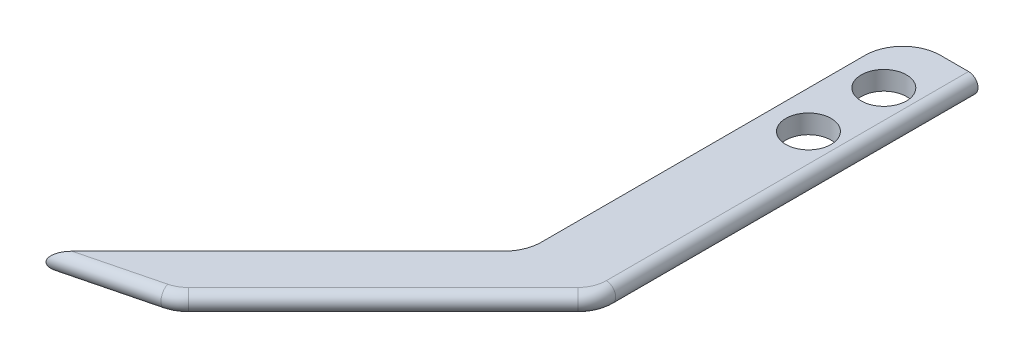
ISO-10303-21;
HEADER;
FILE_DESCRIPTION(('STEP AP214'),'2;1');
FILE_NAME('part.step','',(''),(''),'','','');
FILE_SCHEMA(('AUTOMOTIVE_DESIGN { 1 0 10303 214 1 1 1 1 }'));
ENDSEC;
DATA;
#1=APPLICATION_CONTEXT('core data for automotive mechanical design processes');
#2=APPLICATION_PROTOCOL_DEFINITION('international standard','automotive_design',2000,#1);
#3=PRODUCT_CONTEXT('',#1,'mechanical');
#4=PRODUCT('Part','Part','',(#3));
#5=PRODUCT_RELATED_PRODUCT_CATEGORY('part','',(#4));
#6=PRODUCT_DEFINITION_FORMATION('','',#4);
#7=PRODUCT_DEFINITION_CONTEXT('part definition',#1,'design');
#8=PRODUCT_DEFINITION('design','',#6,#7);
#9=PRODUCT_DEFINITION_SHAPE('','',#8);
#10=(LENGTH_UNIT() NAMED_UNIT(*) SI_UNIT(.MILLI.,.METRE.));
#11=(NAMED_UNIT(*) PLANE_ANGLE_UNIT() SI_UNIT($,.RADIAN.));
#12=(NAMED_UNIT(*) SI_UNIT($,.STERADIAN.) SOLID_ANGLE_UNIT());
#13=UNCERTAINTY_MEASURE_WITH_UNIT(LENGTH_MEASURE(1.E-05),#10,'distance_accuracy_value','');
#14=(GEOMETRIC_REPRESENTATION_CONTEXT(3) GLOBAL_UNCERTAINTY_ASSIGNED_CONTEXT((#13)) GLOBAL_UNIT_ASSIGNED_CONTEXT((#10,
#11,#12)) REPRESENTATION_CONTEXT('',''));
#15=CARTESIAN_POINT('',(0.,0.,0.));
#16=DIRECTION('',(0.,0.,1.));
#17=DIRECTION('',(1.,0.,0.));
#18=AXIS2_PLACEMENT_3D('',#15,#16,#17);
#19=CARTESIAN_POINT('',(9.95446971383413,2.5,96.1124874977272));
#20=DIRECTION('',(0.,1.,0.));
#21=DIRECTION('',(0.,0.,1.));
#22=AXIS2_PLACEMENT_3D('',#19,#20,#21);
#23=TOROIDAL_SURFACE('',#22,7.5,2.5);
#24=CARTESIAN_POINT('',(17.4544697138341,2.5,96.1124874977272));
#25=DIRECTION('',(0.,0.,-1.));
#26=DIRECTION('',(-1.,0.,0.));
#27=AXIS2_PLACEMENT_3D('',#24,#25,#26);
#28=CIRCLE('',#27,2.5);
#29=CARTESIAN_POINT('',(17.4544697138341,5.,96.1124874977272));
#30=VERTEX_POINT('',#29);
#31=CARTESIAN_POINT('',(17.4544697138341,0.,96.1124874977272));
#32=VERTEX_POINT('',#31);
#33=EDGE_CURVE('E11',#30,#32,#28,.T.);
#34=ORIENTED_EDGE('',*,*,#33,.F.);
#35=CARTESIAN_POINT('',(9.95446971383413,5.,96.1124874977272));
#36=DIRECTION('',(0.,1.,0.));
#37=DIRECTION('',(0.,0.,1.));
#38=AXIS2_PLACEMENT_3D('',#35,#36,#37);
#39=CIRCLE('',#38,7.5);
#40=CARTESIAN_POINT('',(15.2577705727332,5.,101.415788356626));
#41=VERTEX_POINT('',#40);
#42=EDGE_CURVE('E165',#41,#30,#39,.T.);
#43=ORIENTED_EDGE('',*,*,#42,.F.);
#44=CARTESIAN_POINT('',(15.2577705727332,2.5,101.415788356626));
#45=DIRECTION('',(0.70710678118654,0.,-0.707106781186555));
#46=DIRECTION('',(-0.707106781186555,0.,-0.70710678118654));
#47=AXIS2_PLACEMENT_3D('',#44,#45,#46);
#48=CIRCLE('',#47,2.5);
#49=CARTESIAN_POINT('',(15.2577705727332,0.,101.415788356626));
#50=VERTEX_POINT('',#49);
#51=EDGE_CURVE('E48',#41,#50,#48,.T.);
#52=ORIENTED_EDGE('',*,*,#51,.T.);
#53=CARTESIAN_POINT('',(9.95446971383413,0.,96.1124874977272));
#54=DIRECTION('',(0.,1.,0.));
#55=DIRECTION('',(0.,0.,1.));
#56=AXIS2_PLACEMENT_3D('',#53,#54,#55);
#57=CIRCLE('',#56,7.5);
#58=EDGE_CURVE('E180',#32,#50,#57,.F.);
#59=ORIENTED_EDGE('',*,*,#58,.F.);
#60=EDGE_LOOP('',(#34,#43,#52,#59));
#61=FACE_BOUND('',#60,.T.);
#62=ADVANCED_FACE('F39',(#61),#23,.T.);
#63=CARTESIAN_POINT('',(-36.431223227239,2.5,153.104782156599));
#64=DIRECTION('',(0.707106781186547,0.,-0.707106781186548));
#65=DIRECTION('',(-0.707106781186548,0.,-0.707106781186547));
#66=AXIS2_PLACEMENT_3D('',#63,#64,#65);
#67=CYLINDRICAL_SURFACE('',#66,2.5);
#68=ORIENTED_EDGE('',*,*,#51,.F.);
#69=DIRECTION('',(-0.707106781186547,0.,0.707106781186548));
#70=VECTOR('',#69,1.);
#71=CARTESIAN_POINT('',(-36.431223227239,5.,153.104782156599));
#72=LINE('',#71,#70);
#73=CARTESIAN_POINT('',(-36.4312232272391,5.,153.104782156599));
#74=VERTEX_POINT('',#73);
#75=EDGE_CURVE('E168',#74,#41,#72,.F.);
#76=ORIENTED_EDGE('',*,*,#75,.F.);
#77=CARTESIAN_POINT('',(-36.431223227239,2.5,153.104782156599));
#78=DIRECTION('',(0.70710678118655,0.,-0.707106781186545));
#79=DIRECTION('',(-0.707106781186545,0.,-0.70710678118655));
#80=AXIS2_PLACEMENT_3D('',#77,#78,#79);
#81=CIRCLE('',#80,2.5);
#82=CARTESIAN_POINT('',(-36.4312232272391,0.,153.104782156599));
#83=VERTEX_POINT('',#82);
#84=EDGE_CURVE('E63',#74,#83,#81,.T.);
#85=ORIENTED_EDGE('',*,*,#84,.T.);
#86=DIRECTION('',(0.707106781186547,0.,-0.707106781186548));
#87=VECTOR('',#86,1.);
#88=CARTESIAN_POINT('',(58.3367794646798,0.,58.3367794646797));
#89=LINE('',#88,#87);
#90=EDGE_CURVE('E183',#50,#83,#89,.F.);
#91=ORIENTED_EDGE('',*,*,#90,.F.);
#92=EDGE_LOOP('',(#68,#76,#85,#91));
#93=FACE_BOUND('',#92,.T.);
#94=ADVANCED_FACE('F198',(#93),#67,.T.);
#95=CARTESIAN_POINT('',(-41.7345240861382,2.5,147.801481297699));
#96=DIRECTION('',(0.,1.,0.));
#97=DIRECTION('',(0.,0.,1.));
#98=AXIS2_PLACEMENT_3D('',#95,#96,#97);
#99=TOROIDAL_SURFACE('',#98,7.5,2.5);
#100=ORIENTED_EDGE('',*,*,#84,.F.);
#101=CARTESIAN_POINT('',(-41.7345240861382,5.,147.801481297699));
#102=DIRECTION('',(0.,1.,0.));
#103=DIRECTION('',(0.,0.,1.));
#104=AXIS2_PLACEMENT_3D('',#101,#102,#103);
#105=CIRCLE('',#104,7.5);
#106=CARTESIAN_POINT('',(-39.9003000369376,5.,155.073731440354));
#107=VERTEX_POINT('',#106);
#108=EDGE_CURVE('E171',#107,#74,#105,.T.);
#109=ORIENTED_EDGE('',*,*,#108,.F.);
#110=CARTESIAN_POINT('',(-39.9003000369377,2.5,155.073731440354));
#111=DIRECTION('',(0.969633352353896,0.,-0.244563206560073));
#112=DIRECTION('',(-0.244563206560073,0.,-0.969633352353896));
#113=AXIS2_PLACEMENT_3D('',#110,#111,#112);
#114=CIRCLE('',#113,2.5);
#115=CARTESIAN_POINT('',(-39.9003000369376,0.,155.073731440354));
#116=VERTEX_POINT('',#115);
#117=EDGE_CURVE('E55',#107,#116,#114,.T.);
#118=ORIENTED_EDGE('',*,*,#117,.T.);
#119=CARTESIAN_POINT('',(-41.7345240861382,0.,147.801481297699));
#120=DIRECTION('',(0.,1.,0.));
#121=DIRECTION('',(0.,0.,1.));
#122=AXIS2_PLACEMENT_3D('',#119,#120,#121);
#123=CIRCLE('',#122,7.5);
#124=EDGE_CURVE('E186',#83,#116,#123,.F.);
#125=ORIENTED_EDGE('',*,*,#124,.F.);
#126=EDGE_LOOP('',(#100,#109,#118,#125));
#127=FACE_BOUND('',#126,.T.);
#128=ADVANCED_FACE('F210',(#127),#99,.T.);
#129=CARTESIAN_POINT('',(-60.1916680428544,2.5,160.191668042854));
#130=DIRECTION('',(0.969633352353897,0.,-0.24456320656007));
#131=DIRECTION('',(-0.24456320656007,0.,-0.969633352353897));
#132=AXIS2_PLACEMENT_3D('',#129,#130,#131);
#133=CYLINDRICAL_SURFACE('',#132,2.5);
#134=ORIENTED_EDGE('',*,*,#117,.F.);
#135=DIRECTION('',(-0.969633352353897,0.,0.24456320656007));
#136=VECTOR('',#135,1.);
#137=CARTESIAN_POINT('',(-60.1916680428544,5.,160.191668042854));
#138=LINE('',#137,#136);
#139=CARTESIAN_POINT('',(-60.1916680428543,5.,160.191668042854));
#140=VERTEX_POINT('',#139);
#141=EDGE_CURVE('E174',#140,#107,#138,.F.);
#142=ORIENTED_EDGE('',*,*,#141,.F.);
#143=CARTESIAN_POINT('',(-60.1916680428543,2.5,160.191668042854));
#144=DIRECTION('',(0.707106781186548,0.,0.707106781186548));
#145=DIRECTION('',(0.707106781186548,0.,-0.707106781186548));
#146=AXIS2_PLACEMENT_3D('',#143,#144,#145);
#147=ELLIPSE('',#146,4.87612671193617,2.5);
#148=CARTESIAN_POINT('',(-60.1916680428543,0.,160.191668042854));
#149=VERTEX_POINT('',#148);
#150=EDGE_CURVE('E190',#149,#140,#147,.F.);
#151=ORIENTED_EDGE('',*,*,#150,.F.);
#152=DIRECTION('',(0.969633352353897,0.,-0.24456320656007));
#153=VECTOR('',#152,1.);
#154=CARTESIAN_POINT('',(34.3871806017733,0.,136.336768207636));
#155=LINE('',#154,#153);
#156=EDGE_CURVE('E188',#116,#149,#155,.F.);
#157=ORIENTED_EDGE('',*,*,#156,.F.);
#158=EDGE_LOOP('',(#134,#142,#151,#157));
#159=FACE_BOUND('',#158,.T.);
#160=ADVANCED_FACE('F266',(#159),#133,.T.);
#161=CARTESIAN_POINT('',(17.4544697138341,2.5,96.1124874977272));
#162=DIRECTION('',(0.,0.,-1.));
#163=DIRECTION('',(-1.,0.,0.));
#164=AXIS2_PLACEMENT_3D('',#161,#162,#163);
#165=CYLINDRICAL_SURFACE('',#164,2.5);
#166=DIRECTION('',(0.,0.,1.));
#167=VECTOR('',#166,1.);
#168=CARTESIAN_POINT('',(17.4544697138341,5.,96.1124874977272));
#169=LINE('',#168,#167);
#170=CARTESIAN_POINT('',(17.4544697138342,5.,0.));
#171=VERTEX_POINT('',#170);
#172=EDGE_CURVE('E162',#30,#171,#169,.F.);
#173=ORIENTED_EDGE('',*,*,#172,.F.);
#174=ORIENTED_EDGE('',*,*,#33,.T.);
#175=DIRECTION('',(0.,0.,-1.));
#176=VECTOR('',#175,1.);
#177=CARTESIAN_POINT('',(17.4544697138342,0.,0.));
#178=LINE('',#177,#176);
#179=CARTESIAN_POINT('',(17.4544697138342,0.,0.));
#180=VERTEX_POINT('',#179);
#181=EDGE_CURVE('E177',#180,#32,#178,.F.);
#182=ORIENTED_EDGE('',*,*,#181,.F.);
#183=CARTESIAN_POINT('',(17.4544697138342,2.5,0.));
#184=DIRECTION('',(0.,0.,1.));
#185=DIRECTION('',(1.,0.,0.));
#186=AXIS2_PLACEMENT_3D('',#183,#184,#185);
#187=CIRCLE('',#186,2.5);
#188=EDGE_CURVE('E192',#171,#180,#187,.F.);
#189=ORIENTED_EDGE('',*,*,#188,.F.);
#190=EDGE_LOOP('',(#173,#174,#182,#189));
#191=FACE_BOUND('',#190,.T.);
#192=ADVANCED_FACE('F42',(#191),#165,.T.);
#193=CARTESIAN_POINT('',(10.,5.,10.));
#194=DIRECTION('',(0.,1.,0.));
#195=DIRECTION('',(0.,0.,1.));
#196=AXIS2_PLACEMENT_3D('',#193,#194,#195);
#197=CYLINDRICAL_SURFACE('',#196,10.);
#198=DIRECTION('',(0.,1.,0.));
#199=VECTOR('',#198,1.);
#200=CARTESIAN_POINT('',(10.,5.,0.));
#201=LINE('',#200,#199);
#202=CARTESIAN_POINT('',(10.,0.,0.));
#203=VERTEX_POINT('',#202);
#204=CARTESIAN_POINT('',(10.,5.,0.));
#205=VERTEX_POINT('',#204);
#206=EDGE_CURVE('E154',#203,#205,#201,.T.);
#207=ORIENTED_EDGE('',*,*,#206,.F.);
#208=CARTESIAN_POINT('',(10.,0.,10.));
#209=DIRECTION('',(0.,1.,0.));
#210=DIRECTION('',(0.,0.,1.));
#211=AXIS2_PLACEMENT_3D('',#208,#209,#210);
#212=CIRCLE('',#211,10.);
#213=CARTESIAN_POINT('',(0.,0.,10.));
#214=VERTEX_POINT('',#213);
#215=EDGE_CURVE('E158',#214,#203,#212,.F.);
#216=ORIENTED_EDGE('',*,*,#215,.F.);
#217=DIRECTION('',(0.,1.,0.));
#218=VECTOR('',#217,1.);
#219=CARTESIAN_POINT('',(0.,5.,10.));
#220=LINE('',#219,#218);
#221=CARTESIAN_POINT('',(0.,5.,10.));
#222=VERTEX_POINT('',#221);
#223=EDGE_CURVE('E125',#222,#214,#220,.F.);
#224=ORIENTED_EDGE('',*,*,#223,.F.);
#225=CARTESIAN_POINT('',(10.,5.,10.));
#226=DIRECTION('',(0.,1.,0.));
#227=DIRECTION('',(0.,0.,1.));
#228=AXIS2_PLACEMENT_3D('',#225,#226,#227);
#229=CIRCLE('',#228,10.);
#230=EDGE_CURVE('E160',#205,#222,#229,.T.);
#231=ORIENTED_EDGE('',*,*,#230,.F.);
#232=EDGE_LOOP('',(#207,#216,#224,#231));
#233=FACE_BOUND('',#232,.T.);
#234=ADVANCED_FACE('F236',(#233),#197,.T.);
#235=CARTESIAN_POINT('',(-9.99999999999999,5.,95.8578643762691));
#236=DIRECTION('',(0.,-1.,0.));
#237=DIRECTION('',(0.,0.,-1.));
#238=AXIS2_PLACEMENT_3D('',#235,#236,#237);
#239=CYLINDRICAL_SURFACE('',#238,10.);
#240=DIRECTION('',(0.,1.,0.));
#241=VECTOR('',#240,1.);
#242=CARTESIAN_POINT('',(0.,5.,95.8578643762691));
#243=LINE('',#242,#241);
#244=CARTESIAN_POINT('',(0.,0.,95.8578643762691));
#245=VERTEX_POINT('',#244);
#246=CARTESIAN_POINT('',(0.,5.,95.8578643762691));
#247=VERTEX_POINT('',#246);
#248=EDGE_CURVE('E123',#245,#247,#243,.T.);
#249=ORIENTED_EDGE('',*,*,#248,.F.);
#250=CARTESIAN_POINT('',(-9.99999999999999,0.,95.8578643762691));
#251=DIRECTION('',(0.,1.,0.));
#252=DIRECTION('',(0.,0.,1.));
#253=AXIS2_PLACEMENT_3D('',#250,#251,#252);
#254=CIRCLE('',#253,10.);
#255=CARTESIAN_POINT('',(-2.92893218813451,0.,102.928932188135));
#256=VERTEX_POINT('',#255);
#257=EDGE_CURVE('E132',#245,#256,#254,.F.);
#258=ORIENTED_EDGE('',*,*,#257,.T.);
#259=DIRECTION('',(0.,1.,0.));
#260=VECTOR('',#259,1.);
#261=CARTESIAN_POINT('',(-2.92893218813452,5.,102.928932188135));
#262=LINE('',#261,#260);
#263=CARTESIAN_POINT('',(-2.92893218813451,5.,102.928932188135));
#264=VERTEX_POINT('',#263);
#265=EDGE_CURVE('E141',#264,#256,#262,.F.);
#266=ORIENTED_EDGE('',*,*,#265,.F.);
#267=CARTESIAN_POINT('',(-9.99999999999999,5.,95.8578643762691));
#268=DIRECTION('',(0.,1.,0.));
#269=DIRECTION('',(0.,0.,1.));
#270=AXIS2_PLACEMENT_3D('',#267,#268,#269);
#271=CIRCLE('',#270,10.);
#272=EDGE_CURVE('E140',#264,#247,#271,.T.);
#273=ORIENTED_EDGE('',*,*,#272,.T.);
#274=EDGE_LOOP('',(#249,#258,#266,#273));
#275=FACE_BOUND('',#274,.T.);
#276=ADVANCED_FACE('F144',(#275),#239,.F.);
#277=CARTESIAN_POINT('',(0.,5.,0.));
#278=DIRECTION('',(1.,0.,0.));
#279=DIRECTION('',(0.,0.,-1.));
#280=AXIS2_PLACEMENT_3D('',#277,#278,#279);
#281=PLANE('',#280);
#282=DIRECTION('',(0.,0.,1.));
#283=VECTOR('',#282,1.);
#284=CARTESIAN_POINT('',(0.,5.,0.));
#285=LINE('',#284,#283);
#286=EDGE_CURVE('E216',#222,#247,#285,.T.);
#287=ORIENTED_EDGE('',*,*,#286,.F.);
#288=ORIENTED_EDGE('',*,*,#223,.T.);
#289=DIRECTION('',(0.,0.,1.));
#290=VECTOR('',#289,1.);
#291=CARTESIAN_POINT('',(0.,0.,0.));
#292=LINE('',#291,#290);
#293=EDGE_CURVE('E118',#214,#245,#292,.T.);
#294=ORIENTED_EDGE('',*,*,#293,.T.);
#295=ORIENTED_EDGE('',*,*,#248,.T.);
#296=EDGE_LOOP('',(#287,#288,#294,#295));
#297=FACE_BOUND('',#296,.T.);
#298=ADVANCED_FACE('F121',(#297),#281,.F.);
#299=CARTESIAN_POINT('',(0.,5.,100.));
#300=DIRECTION('',(0.707106781186548,0.,0.707106781186548));
#301=DIRECTION('',(0.707106781186548,0.,-0.707106781186548));
#302=AXIS2_PLACEMENT_3D('',#299,#300,#301);
#303=PLANE('',#302);
#304=DIRECTION('',(-0.707106781186547,0.,0.707106781186547));
#305=VECTOR('',#304,1.);
#306=CARTESIAN_POINT('',(0.,0.,100.));
#307=LINE('',#306,#305);
#308=EDGE_CURVE('E128',#256,#149,#307,.T.);
#309=ORIENTED_EDGE('',*,*,#308,.T.);
#310=ORIENTED_EDGE('',*,*,#150,.T.);
#311=DIRECTION('',(-0.707106781186547,0.,0.707106781186547));
#312=VECTOR('',#311,1.);
#313=CARTESIAN_POINT('',(0.,5.,100.));
#314=LINE('',#313,#312);
#315=EDGE_CURVE('E148',#264,#140,#314,.T.);
#316=ORIENTED_EDGE('',*,*,#315,.F.);
#317=ORIENTED_EDGE('',*,*,#265,.T.);
#318=EDGE_LOOP('',(#309,#310,#316,#317));
#319=FACE_BOUND('',#318,.T.);
#320=ADVANCED_FACE('F213',(#319),#303,.F.);
#321=CARTESIAN_POINT('',(0.,5.,0.));
#322=DIRECTION('',(0.,0.,1.));
#323=DIRECTION('',(1.,0.,0.));
#324=AXIS2_PLACEMENT_3D('',#321,#322,#323);
#325=PLANE('',#324);
#326=DIRECTION('',(-1.,0.,0.));
#327=VECTOR('',#326,1.);
#328=CARTESIAN_POINT('',(0.,5.,0.));
#329=LINE('',#328,#327);
#330=EDGE_CURVE('E145',#171,#205,#329,.T.);
#331=ORIENTED_EDGE('',*,*,#330,.F.);
#332=ORIENTED_EDGE('',*,*,#188,.T.);
#333=DIRECTION('',(-1.,0.,0.));
#334=VECTOR('',#333,1.);
#335=CARTESIAN_POINT('',(0.,0.,0.));
#336=LINE('',#335,#334);
#337=EDGE_CURVE('E201',#180,#203,#336,.T.);
#338=ORIENTED_EDGE('',*,*,#337,.T.);
#339=ORIENTED_EDGE('',*,*,#206,.T.);
#340=EDGE_LOOP('',(#331,#332,#338,#339));
#341=FACE_BOUND('',#340,.T.);
#342=ADVANCED_FACE('F238',(#341),#325,.F.);
#343=CARTESIAN_POINT('',(0.,5.,0.));
#344=DIRECTION('',(0.,1.,0.));
#345=DIRECTION('',(0.,0.,1.));
#346=AXIS2_PLACEMENT_3D('',#343,#344,#345);
#347=PLANE('',#346);
#348=ORIENTED_EDGE('',*,*,#315,.T.);
#349=ORIENTED_EDGE('',*,*,#141,.T.);
#350=ORIENTED_EDGE('',*,*,#108,.T.);
#351=ORIENTED_EDGE('',*,*,#75,.T.);
#352=ORIENTED_EDGE('',*,*,#42,.T.);
#353=ORIENTED_EDGE('',*,*,#172,.T.);
#354=ORIENTED_EDGE('',*,*,#330,.T.);
#355=ORIENTED_EDGE('',*,*,#230,.T.);
#356=ORIENTED_EDGE('',*,*,#286,.T.);
#357=ORIENTED_EDGE('',*,*,#272,.F.);
#358=EDGE_LOOP('',(#348,#349,#350,#351,#352,#353,#354,#355,#356,#357));
#359=FACE_BOUND('',#358,.T.);
#360=CARTESIAN_POINT('',(9.97723485691706,5.,35.));
#361=DIRECTION('',(0.,1.,0.));
#362=DIRECTION('',(0.,0.,1.));
#363=AXIS2_PLACEMENT_3D('',#360,#361,#362);
#364=CIRCLE('',#363,6.);
#365=CARTESIAN_POINT('',(9.97723485691706,5.,41.));
#366=VERTEX_POINT('',#365);
#367=EDGE_CURVE('E220',#366,#366,#364,.T.);
#368=ORIENTED_EDGE('',*,*,#367,.F.);
#369=EDGE_LOOP('',(#368));
#370=FACE_BOUND('',#369,.T.);
#371=CARTESIAN_POINT('',(9.97723485691707,5.,15.));
#372=DIRECTION('',(0.,1.,0.));
#373=DIRECTION('',(0.,0.,1.));
#374=AXIS2_PLACEMENT_3D('',#371,#372,#373);
#375=CIRCLE('',#374,6.);
#376=CARTESIAN_POINT('',(9.97723485691707,5.,21.));
#377=VERTEX_POINT('',#376);
#378=EDGE_CURVE('E225',#377,#377,#375,.T.);
#379=ORIENTED_EDGE('',*,*,#378,.F.);
#380=EDGE_LOOP('',(#379));
#381=FACE_BOUND('',#380,.T.);
#382=ADVANCED_FACE('F206',(#359,#370,#381),#347,.T.);
#383=CARTESIAN_POINT('',(0.,0.,0.));
#384=DIRECTION('',(0.,1.,0.));
#385=DIRECTION('',(0.,0.,1.));
#386=AXIS2_PLACEMENT_3D('',#383,#384,#385);
#387=PLANE('',#386);
#388=CARTESIAN_POINT('',(9.97723485691706,0.,35.));
#389=DIRECTION('',(0.,1.,0.));
#390=DIRECTION('',(0.,0.,1.));
#391=AXIS2_PLACEMENT_3D('',#388,#389,#390);
#392=CIRCLE('',#391,6.);
#393=CARTESIAN_POINT('',(9.97723485691706,0.,41.));
#394=VERTEX_POINT('',#393);
#395=EDGE_CURVE('E129',#394,#394,#392,.T.);
#396=ORIENTED_EDGE('',*,*,#395,.T.);
#397=EDGE_LOOP('',(#396));
#398=FACE_BOUND('',#397,.T.);
#399=CARTESIAN_POINT('',(9.97723485691707,0.,15.));
#400=DIRECTION('',(0.,1.,0.));
#401=DIRECTION('',(0.,0.,1.));
#402=AXIS2_PLACEMENT_3D('',#399,#400,#401);
#403=CIRCLE('',#402,6.);
#404=CARTESIAN_POINT('',(9.97723485691707,0.,21.));
#405=VERTEX_POINT('',#404);
#406=EDGE_CURVE('E218',#405,#405,#403,.T.);
#407=ORIENTED_EDGE('',*,*,#406,.T.);
#408=EDGE_LOOP('',(#407));
#409=FACE_BOUND('',#408,.T.);
#410=ORIENTED_EDGE('',*,*,#124,.T.);
#411=ORIENTED_EDGE('',*,*,#156,.T.);
#412=ORIENTED_EDGE('',*,*,#308,.F.);
#413=ORIENTED_EDGE('',*,*,#257,.F.);
#414=ORIENTED_EDGE('',*,*,#293,.F.);
#415=ORIENTED_EDGE('',*,*,#215,.T.);
#416=ORIENTED_EDGE('',*,*,#337,.F.);
#417=ORIENTED_EDGE('',*,*,#181,.T.);
#418=ORIENTED_EDGE('',*,*,#58,.T.);
#419=ORIENTED_EDGE('',*,*,#90,.T.);
#420=EDGE_LOOP('',(#410,#411,#412,#413,#414,#415,#416,#417,#418,#419));
#421=FACE_BOUND('',#420,.T.);
#422=ADVANCED_FACE('F134',(#398,#409,#421),#387,.F.);
#423=CARTESIAN_POINT('',(9.97723485691707,-10.,15.));
#424=DIRECTION('',(0.,1.,0.));
#425=DIRECTION('',(0.,0.,1.));
#426=AXIS2_PLACEMENT_3D('',#423,#424,#425);
#427=CYLINDRICAL_SURFACE('',#426,6.);
#428=ORIENTED_EDGE('',*,*,#378,.T.);
#429=EDGE_LOOP('',(#428));
#430=FACE_BOUND('',#429,.T.);
#431=ORIENTED_EDGE('',*,*,#406,.F.);
#432=EDGE_LOOP('',(#431));
#433=FACE_BOUND('',#432,.T.);
#434=ADVANCED_FACE('F311',(#430,#433),#427,.F.);
#435=CARTESIAN_POINT('',(9.97723485691706,-10.,35.));
#436=DIRECTION('',(0.,1.,0.));
#437=DIRECTION('',(0.,0.,1.));
#438=AXIS2_PLACEMENT_3D('',#435,#436,#437);
#439=CYLINDRICAL_SURFACE('',#438,6.);
#440=ORIENTED_EDGE('',*,*,#367,.T.);
#441=EDGE_LOOP('',(#440));
#442=FACE_BOUND('',#441,.T.);
#443=ORIENTED_EDGE('',*,*,#395,.F.);
#444=EDGE_LOOP('',(#443));
#445=FACE_BOUND('',#444,.T.);
#446=ADVANCED_FACE('F322',(#442,#445),#439,.F.);
#447=CLOSED_SHELL('',(#62,#94,#128,#160,#192,#234,#276,#298,#320,#342,#382,#422,#434,#446));
#448=MANIFOLD_SOLID_BREP('B2',#447);
#449=ADVANCED_BREP_SHAPE_REPRESENTATION('',(#18,#448),#14);
#450=SHAPE_DEFINITION_REPRESENTATION(#9,#449);
ENDSEC;
END-ISO-10303-21;
